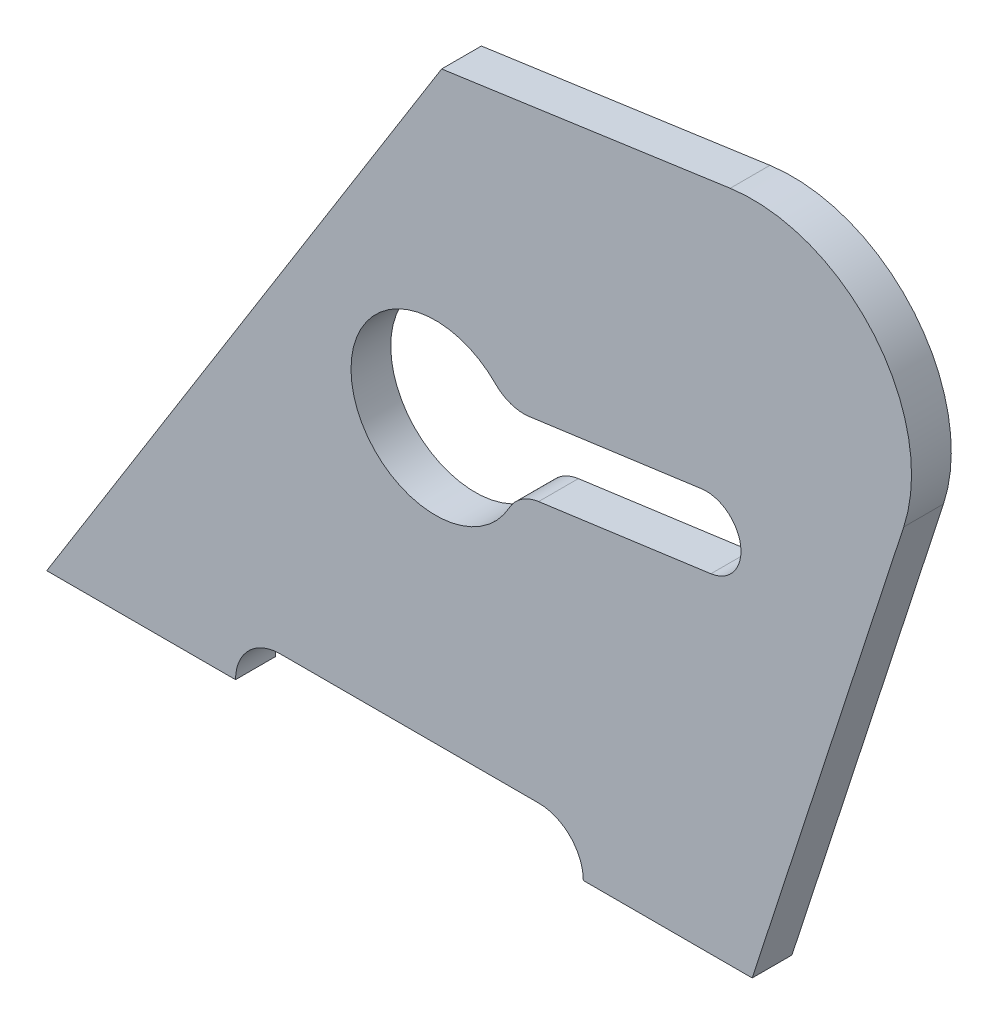
ISO-10303-21;
HEADER;
FILE_DESCRIPTION(('STEP AP214'),'2;1');
FILE_NAME('part.step','',(''),(''),'','','');
FILE_SCHEMA(('AUTOMOTIVE_DESIGN { 1 0 10303 214 1 1 1 1 }'));
ENDSEC;
DATA;
#1=APPLICATION_CONTEXT('core data for automotive mechanical design processes');
#2=APPLICATION_PROTOCOL_DEFINITION('international standard','automotive_design',2000,#1);
#3=PRODUCT_CONTEXT('',#1,'mechanical');
#4=PRODUCT('Part','Part','',(#3));
#5=PRODUCT_RELATED_PRODUCT_CATEGORY('part','',(#4));
#6=PRODUCT_DEFINITION_FORMATION('','',#4);
#7=PRODUCT_DEFINITION_CONTEXT('part definition',#1,'design');
#8=PRODUCT_DEFINITION('design','',#6,#7);
#9=PRODUCT_DEFINITION_SHAPE('','',#8);
#10=(LENGTH_UNIT() NAMED_UNIT(*) SI_UNIT(.MILLI.,.METRE.));
#11=(NAMED_UNIT(*) PLANE_ANGLE_UNIT() SI_UNIT($,.RADIAN.));
#12=(NAMED_UNIT(*) SI_UNIT($,.STERADIAN.) SOLID_ANGLE_UNIT());
#13=UNCERTAINTY_MEASURE_WITH_UNIT(LENGTH_MEASURE(1.E-05),#10,'distance_accuracy_value','');
#14=(GEOMETRIC_REPRESENTATION_CONTEXT(3) GLOBAL_UNCERTAINTY_ASSIGNED_CONTEXT((#13)) GLOBAL_UNIT_ASSIGNED_CONTEXT((#10,
#11,#12)) REPRESENTATION_CONTEXT('',''));
#15=CARTESIAN_POINT('',(0.,0.,0.));
#16=DIRECTION('',(0.,0.,1.));
#17=DIRECTION('',(1.,0.,0.));
#18=AXIS2_PLACEMENT_3D('',#15,#16,#17);
#19=CARTESIAN_POINT('',(142.06973961903,103.768811757372,8.));
#20=DIRECTION('',(0.,0.,-1.));
#21=DIRECTION('',(-1.,0.,0.));
#22=AXIS2_PLACEMENT_3D('',#19,#20,#21);
#23=PLANE('',#22);
#24=DIRECTION('',(1.,0.,0.));
#25=VECTOR('',#24,1.);
#26=CARTESIAN_POINT('',(38.,0.,8.));
#27=LINE('',#26,#25);
#28=CARTESIAN_POINT('',(0.,0.,8.));
#29=VERTEX_POINT('',#28);
#30=CARTESIAN_POINT('',(38.,0.,8.));
#31=VERTEX_POINT('',#30);
#32=EDGE_CURVE('E197',#29,#31,#27,.T.);
#33=ORIENTED_EDGE('',*,*,#32,.T.);
#34=CARTESIAN_POINT('',(47.,0.,8.));
#35=DIRECTION('',(0.,0.,-1.));
#36=DIRECTION('',(1.,0.,0.));
#37=AXIS2_PLACEMENT_3D('',#34,#35,#36);
#38=CIRCLE('',#37,9.);
#39=CARTESIAN_POINT('',(47.,9.,8.));
#40=VERTEX_POINT('',#39);
#41=EDGE_CURVE('E200',#31,#40,#38,.T.);
#42=ORIENTED_EDGE('',*,*,#41,.T.);
#43=DIRECTION('',(1.,0.,0.));
#44=VECTOR('',#43,1.);
#45=CARTESIAN_POINT('',(99.,9.00000000000001,8.));
#46=LINE('',#45,#44);
#47=CARTESIAN_POINT('',(99.,9.,8.));
#48=VERTEX_POINT('',#47);
#49=EDGE_CURVE('E201',#40,#48,#46,.T.);
#50=ORIENTED_EDGE('',*,*,#49,.T.);
#51=CARTESIAN_POINT('',(99.,0.,8.));
#52=DIRECTION('',(0.,0.,-1.));
#53=DIRECTION('',(1.,0.,0.));
#54=AXIS2_PLACEMENT_3D('',#51,#52,#53);
#55=CIRCLE('',#54,8.99999999999999);
#56=CARTESIAN_POINT('',(108.,0.,8.));
#57=VERTEX_POINT('',#56);
#58=EDGE_CURVE('E203',#48,#57,#55,.T.);
#59=ORIENTED_EDGE('',*,*,#58,.T.);
#60=DIRECTION('',(1.,0.,0.));
#61=VECTOR('',#60,1.);
#62=CARTESIAN_POINT('',(142.,0.,8.));
#63=LINE('',#62,#61);
#64=CARTESIAN_POINT('',(142.,0.,8.));
#65=VERTEX_POINT('',#64);
#66=EDGE_CURVE('E207',#57,#65,#63,.T.);
#67=ORIENTED_EDGE('',*,*,#66,.T.);
#68=DIRECTION('',(0.309016994374945,0.951056516295155,0.));
#69=VECTOR('',#68,1.);
#70=CARTESIAN_POINT('',(172.503548140475,93.8802679373735,8.));
#71=LINE('',#70,#69);
#72=CARTESIAN_POINT('',(172.503548140475,93.8802679373735,8.));
#73=VERTEX_POINT('',#72);
#74=EDGE_CURVE('E208',#65,#73,#71,.T.);
#75=ORIENTED_EDGE('',*,*,#74,.T.);
#76=CARTESIAN_POINT('',(142.06973961903,103.768811757372,8.));
#77=DIRECTION('',(0.,0.,1.));
#78=DIRECTION('',(-1.,0.,0.));
#79=AXIS2_PLACEMENT_3D('',#76,#77,#78);
#80=CIRCLE('',#79,32.);
#81=CARTESIAN_POINT('',(137.573015723534,135.451290735628,8.));
#82=VERTEX_POINT('',#81);
#83=EDGE_CURVE('E213',#73,#82,#80,.T.);
#84=ORIENTED_EDGE('',*,*,#83,.T.);
#85=DIRECTION('',(-0.990077468070519,-0.140522621734258,0.));
#86=VECTOR('',#85,1.);
#87=CARTESIAN_POINT('',(79.4878896349813,127.207214423464,8.));
#88=LINE('',#87,#86);
#89=CARTESIAN_POINT('',(79.4878896349813,127.207214423464,8.));
#90=VERTEX_POINT('',#89);
#91=EDGE_CURVE('E211',#82,#90,#88,.T.);
#92=ORIENTED_EDGE('',*,*,#91,.T.);
#93=DIRECTION('',(-0.529919264233209,-0.848048096156424,0.));
#94=VECTOR('',#93,1.);
#95=CARTESIAN_POINT('',(0.,0.,8.));
#96=LINE('',#95,#94);
#97=EDGE_CURVE('E214',#90,#29,#96,.T.);
#98=ORIENTED_EDGE('',*,*,#97,.T.);
#99=EDGE_LOOP('',(#33,#42,#50,#59,#67,#75,#84,#92,#98));
#100=FACE_BOUND('',#99,.T.);
#101=CARTESIAN_POINT('',(132.7354236822,73.244757424037,8.));
#102=DIRECTION('',(0.,0.,1.));
#103=DIRECTION('',(1.,0.,0.));
#104=AXIS2_PLACEMENT_3D('',#101,#102,#103);
#105=CIRCLE('',#104,7.00000000000001);
#106=CARTESIAN_POINT('',(133.685771579893,66.3095689714172,8.));
#107=VERTEX_POINT('',#106);
#108=CARTESIAN_POINT('',(131.785075784508,80.1799458766568,8.));
#109=VERTEX_POINT('',#108);
#110=EDGE_CURVE('E147',#107,#109,#105,.T.);
#111=ORIENTED_EDGE('',*,*,#110,.F.);
#112=DIRECTION('',(0.990741207517111,0.135763985384697,0.));
#113=VECTOR('',#112,1.);
#114=CARTESIAN_POINT('',(99.0098293167945,61.5578294829528,8.));
#115=LINE('',#114,#113);
#116=CARTESIAN_POINT('',(99.0098293167945,61.5578294829529,8.));
#117=VERTEX_POINT('',#116);
#118=EDGE_CURVE('E172',#117,#107,#115,.T.);
#119=ORIENTED_EDGE('',*,*,#118,.F.);
#120=CARTESIAN_POINT('',(100.095941199872,53.6318998228159,8.));
#121=DIRECTION('',(0.,0.,-1.));
#122=DIRECTION('',(1.,0.,0.));
#123=AXIS2_PLACEMENT_3D('',#120,#121,#122);
#124=CIRCLE('',#123,8.00000000000001);
#125=CARTESIAN_POINT('',(93.103530341916,57.518568112436,8.));
#126=VERTEX_POINT('',#125);
#127=EDGE_CURVE('E171',#126,#117,#124,.T.);
#128=ORIENTED_EDGE('',*,*,#127,.F.);
#129=CARTESIAN_POINT('',(78.2446572687594,65.7777382278786,8.));
#130=DIRECTION('',(0.,0.,1.));
#131=DIRECTION('',(1.,0.,0.));
#132=AXIS2_PLACEMENT_3D('',#129,#130,#131);
#133=CIRCLE('',#132,17.);
#134=CARTESIAN_POINT('',(90.3339450400682,77.7296887457851,8.));
#135=VERTEX_POINT('',#134);
#136=EDGE_CURVE('E170',#135,#126,#133,.T.);
#137=ORIENTED_EDGE('',*,*,#136,.F.);
#138=CARTESIAN_POINT('',(96.0230216383311,83.3541360483293,8.));
#139=DIRECTION('',(0.,0.,-1.));
#140=DIRECTION('',(-1.,0.,0.));
#141=AXIS2_PLACEMENT_3D('',#138,#139,#140);
#142=CIRCLE('',#141,7.99999999999999);
#143=CARTESIAN_POINT('',(97.1091335214087,75.4282063881924,8.));
#144=VERTEX_POINT('',#143);
#145=EDGE_CURVE('E167',#144,#135,#142,.T.);
#146=ORIENTED_EDGE('',*,*,#145,.F.);
#147=DIRECTION('',(-0.990741207517111,-0.135763985384699,0.));
#148=VECTOR('',#147,1.);
#149=CARTESIAN_POINT('',(97.1091335214087,75.4282063881924,8.));
#150=LINE('',#149,#148);
#151=EDGE_CURVE('E153',#109,#144,#150,.T.);
#152=ORIENTED_EDGE('',*,*,#151,.F.);
#153=EDGE_LOOP('',(#111,#119,#128,#137,#146,#152));
#154=FACE_BOUND('',#153,.T.);
#155=ADVANCED_FACE('F39',(#100,#154),#23,.F.);
#156=CARTESIAN_POINT('',(142.06973961903,103.768811757372,0.));
#157=DIRECTION('',(0.,0.,-1.));
#158=DIRECTION('',(-1.,0.,0.));
#159=AXIS2_PLACEMENT_3D('',#156,#157,#158);
#160=PLANE('',#159);
#161=DIRECTION('',(1.,0.,0.));
#162=VECTOR('',#161,1.);
#163=CARTESIAN_POINT('',(38.,0.,0.));
#164=LINE('',#163,#162);
#165=CARTESIAN_POINT('',(0.,0.,0.));
#166=VERTEX_POINT('',#165);
#167=CARTESIAN_POINT('',(38.,0.,0.));
#168=VERTEX_POINT('',#167);
#169=EDGE_CURVE('E162',#166,#168,#164,.T.);
#170=ORIENTED_EDGE('',*,*,#169,.F.);
#171=DIRECTION('',(-0.529919264233209,-0.848048096156424,0.));
#172=VECTOR('',#171,1.);
#173=CARTESIAN_POINT('',(0.,0.,0.));
#174=LINE('',#173,#172);
#175=CARTESIAN_POINT('',(79.4878896349813,127.207214423464,0.));
#176=VERTEX_POINT('',#175);
#177=EDGE_CURVE('E202',#176,#166,#174,.T.);
#178=ORIENTED_EDGE('',*,*,#177,.F.);
#179=DIRECTION('',(-0.990077468070519,-0.140522621734258,0.));
#180=VECTOR('',#179,1.);
#181=CARTESIAN_POINT('',(79.4878896349813,127.207214423464,0.));
#182=LINE('',#181,#180);
#183=CARTESIAN_POINT('',(137.573015723534,135.451290735628,0.));
#184=VERTEX_POINT('',#183);
#185=EDGE_CURVE('E235',#184,#176,#182,.T.);
#186=ORIENTED_EDGE('',*,*,#185,.F.);
#187=CARTESIAN_POINT('',(142.06973961903,103.768811757372,0.));
#188=DIRECTION('',(0.,0.,1.));
#189=DIRECTION('',(-1.,0.,0.));
#190=AXIS2_PLACEMENT_3D('',#187,#188,#189);
#191=CIRCLE('',#190,32.);
#192=CARTESIAN_POINT('',(172.503548140475,93.8802679373735,0.));
#193=VERTEX_POINT('',#192);
#194=EDGE_CURVE('E229',#193,#184,#191,.T.);
#195=ORIENTED_EDGE('',*,*,#194,.F.);
#196=DIRECTION('',(0.309016994374945,0.951056516295155,0.));
#197=VECTOR('',#196,1.);
#198=CARTESIAN_POINT('',(172.503548140475,93.8802679373735,0.));
#199=LINE('',#198,#197);
#200=CARTESIAN_POINT('',(142.,0.,0.));
#201=VERTEX_POINT('',#200);
#202=EDGE_CURVE('E228',#201,#193,#199,.T.);
#203=ORIENTED_EDGE('',*,*,#202,.F.);
#204=DIRECTION('',(1.,0.,0.));
#205=VECTOR('',#204,1.);
#206=CARTESIAN_POINT('',(142.,0.,0.));
#207=LINE('',#206,#205);
#208=CARTESIAN_POINT('',(108.,0.,0.));
#209=VERTEX_POINT('',#208);
#210=EDGE_CURVE('E226',#209,#201,#207,.T.);
#211=ORIENTED_EDGE('',*,*,#210,.F.);
#212=CARTESIAN_POINT('',(99.,0.,0.));
#213=DIRECTION('',(0.,0.,-1.));
#214=DIRECTION('',(1.,0.,0.));
#215=AXIS2_PLACEMENT_3D('',#212,#213,#214);
#216=CIRCLE('',#215,8.99999999999999);
#217=CARTESIAN_POINT('',(99.,9.,0.));
#218=VERTEX_POINT('',#217);
#219=EDGE_CURVE('E222',#218,#209,#216,.T.);
#220=ORIENTED_EDGE('',*,*,#219,.F.);
#221=DIRECTION('',(1.,0.,0.));
#222=VECTOR('',#221,1.);
#223=CARTESIAN_POINT('',(99.,9.00000000000001,0.));
#224=LINE('',#223,#222);
#225=CARTESIAN_POINT('',(47.,9.,0.));
#226=VERTEX_POINT('',#225);
#227=EDGE_CURVE('E225',#226,#218,#224,.T.);
#228=ORIENTED_EDGE('',*,*,#227,.F.);
#229=CARTESIAN_POINT('',(47.,0.,0.));
#230=DIRECTION('',(0.,0.,-1.));
#231=DIRECTION('',(1.,0.,0.));
#232=AXIS2_PLACEMENT_3D('',#229,#230,#231);
#233=CIRCLE('',#232,9.);
#234=EDGE_CURVE('E217',#168,#226,#233,.T.);
#235=ORIENTED_EDGE('',*,*,#234,.F.);
#236=EDGE_LOOP('',(#170,#178,#186,#195,#203,#211,#220,#228,#235));
#237=FACE_BOUND('',#236,.T.);
#238=DIRECTION('',(0.990741207517111,0.135763985384697,0.));
#239=VECTOR('',#238,1.);
#240=CARTESIAN_POINT('',(99.0098293167945,61.5578294829528,0.));
#241=LINE('',#240,#239);
#242=CARTESIAN_POINT('',(99.0098293167945,61.5578294829528,0.));
#243=VERTEX_POINT('',#242);
#244=CARTESIAN_POINT('',(133.685771579893,66.3095689714173,0.));
#245=VERTEX_POINT('',#244);
#246=EDGE_CURVE('E155',#243,#245,#241,.T.);
#247=ORIENTED_EDGE('',*,*,#246,.T.);
#248=CARTESIAN_POINT('',(132.7354236822,73.244757424037,0.));
#249=DIRECTION('',(0.,0.,1.));
#250=DIRECTION('',(1.,0.,0.));
#251=AXIS2_PLACEMENT_3D('',#248,#249,#250);
#252=CIRCLE('',#251,7.00000000000001);
#253=CARTESIAN_POINT('',(131.785075784508,80.1799458766568,0.));
#254=VERTEX_POINT('',#253);
#255=EDGE_CURVE('E62',#245,#254,#252,.T.);
#256=ORIENTED_EDGE('',*,*,#255,.T.);
#257=DIRECTION('',(-0.990741207517111,-0.135763985384699,0.));
#258=VECTOR('',#257,1.);
#259=CARTESIAN_POINT('',(97.1091335214087,75.4282063881924,0.));
#260=LINE('',#259,#258);
#261=CARTESIAN_POINT('',(97.1091335214087,75.4282063881924,0.));
#262=VERTEX_POINT('',#261);
#263=EDGE_CURVE('E161',#254,#262,#260,.T.);
#264=ORIENTED_EDGE('',*,*,#263,.T.);
#265=CARTESIAN_POINT('',(96.0230216383311,83.3541360483293,0.));
#266=DIRECTION('',(0.,0.,-1.));
#267=DIRECTION('',(-1.,0.,0.));
#268=AXIS2_PLACEMENT_3D('',#265,#266,#267);
#269=CIRCLE('',#268,7.99999999999999);
#270=CARTESIAN_POINT('',(90.3339450400682,77.7296887457851,0.));
#271=VERTEX_POINT('',#270);
#272=EDGE_CURVE('E177',#262,#271,#269,.T.);
#273=ORIENTED_EDGE('',*,*,#272,.T.);
#274=CARTESIAN_POINT('',(78.2446572687594,65.7777382278786,0.));
#275=DIRECTION('',(0.,0.,1.));
#276=DIRECTION('',(1.,0.,0.));
#277=AXIS2_PLACEMENT_3D('',#274,#275,#276);
#278=CIRCLE('',#277,17.);
#279=CARTESIAN_POINT('',(93.103530341916,57.518568112436,0.));
#280=VERTEX_POINT('',#279);
#281=EDGE_CURVE('E185',#271,#280,#278,.T.);
#282=ORIENTED_EDGE('',*,*,#281,.T.);
#283=CARTESIAN_POINT('',(100.095941199872,53.6318998228159,0.));
#284=DIRECTION('',(0.,0.,-1.));
#285=DIRECTION('',(1.,0.,0.));
#286=AXIS2_PLACEMENT_3D('',#283,#284,#285);
#287=CIRCLE('',#286,8.00000000000001);
#288=EDGE_CURVE('E184',#280,#243,#287,.T.);
#289=ORIENTED_EDGE('',*,*,#288,.T.);
#290=EDGE_LOOP('',(#247,#256,#264,#273,#282,#289));
#291=FACE_BOUND('',#290,.T.);
#292=ADVANCED_FACE('F262',(#237,#291),#160,.T.);
#293=CARTESIAN_POINT('',(38.,0.,8.));
#294=DIRECTION('',(0.,1.,0.));
#295=DIRECTION('',(-1.,0.,0.));
#296=AXIS2_PLACEMENT_3D('',#293,#294,#295);
#297=PLANE('',#296);
#298=ORIENTED_EDGE('',*,*,#169,.T.);
#299=DIRECTION('',(0.,0.,-1.));
#300=VECTOR('',#299,1.);
#301=CARTESIAN_POINT('',(38.,0.,8.));
#302=LINE('',#301,#300);
#303=EDGE_CURVE('E11',#31,#168,#302,.T.);
#304=ORIENTED_EDGE('',*,*,#303,.F.);
#305=ORIENTED_EDGE('',*,*,#32,.F.);
#306=DIRECTION('',(0.,0.,-1.));
#307=VECTOR('',#306,1.);
#308=CARTESIAN_POINT('',(0.,0.,8.));
#309=LINE('',#308,#307);
#310=EDGE_CURVE('E220',#29,#166,#309,.T.);
#311=ORIENTED_EDGE('',*,*,#310,.T.);
#312=EDGE_LOOP('',(#298,#304,#305,#311));
#313=FACE_BOUND('',#312,.T.);
#314=ADVANCED_FACE('F41',(#313),#297,.F.);
#315=CARTESIAN_POINT('',(47.,0.,8.));
#316=DIRECTION('',(0.,0.,-1.));
#317=DIRECTION('',(-1.,0.,0.));
#318=AXIS2_PLACEMENT_3D('',#315,#316,#317);
#319=CYLINDRICAL_SURFACE('',#318,9.);
#320=ORIENTED_EDGE('',*,*,#234,.T.);
#321=DIRECTION('',(0.,0.,-1.));
#322=VECTOR('',#321,1.);
#323=CARTESIAN_POINT('',(47.,9.,8.));
#324=LINE('',#323,#322);
#325=EDGE_CURVE('E50',#40,#226,#324,.T.);
#326=ORIENTED_EDGE('',*,*,#325,.F.);
#327=ORIENTED_EDGE('',*,*,#41,.F.);
#328=ORIENTED_EDGE('',*,*,#303,.T.);
#329=EDGE_LOOP('',(#320,#326,#327,#328));
#330=FACE_BOUND('',#329,.T.);
#331=ADVANCED_FACE('F285',(#330),#319,.F.);
#332=CARTESIAN_POINT('',(99.,9.00000000000001,8.));
#333=DIRECTION('',(0.,1.,0.));
#334=DIRECTION('',(-1.,0.,0.));
#335=AXIS2_PLACEMENT_3D('',#332,#333,#334);
#336=PLANE('',#335);
#337=ORIENTED_EDGE('',*,*,#227,.T.);
#338=DIRECTION('',(0.,0.,-1.));
#339=VECTOR('',#338,1.);
#340=CARTESIAN_POINT('',(99.,9.,8.));
#341=LINE('',#340,#339);
#342=EDGE_CURVE('E252',#48,#218,#341,.T.);
#343=ORIENTED_EDGE('',*,*,#342,.F.);
#344=ORIENTED_EDGE('',*,*,#49,.F.);
#345=ORIENTED_EDGE('',*,*,#325,.T.);
#346=EDGE_LOOP('',(#337,#343,#344,#345));
#347=FACE_BOUND('',#346,.T.);
#348=ADVANCED_FACE('F260',(#347),#336,.F.);
#349=CARTESIAN_POINT('',(99.,0.,8.));
#350=DIRECTION('',(0.,0.,-1.));
#351=DIRECTION('',(-1.,0.,0.));
#352=AXIS2_PLACEMENT_3D('',#349,#350,#351);
#353=CYLINDRICAL_SURFACE('',#352,8.99999999999999);
#354=ORIENTED_EDGE('',*,*,#219,.T.);
#355=DIRECTION('',(0.,0.,-1.));
#356=VECTOR('',#355,1.);
#357=CARTESIAN_POINT('',(108.,0.,8.));
#358=LINE('',#357,#356);
#359=EDGE_CURVE('E249',#57,#209,#358,.T.);
#360=ORIENTED_EDGE('',*,*,#359,.F.);
#361=ORIENTED_EDGE('',*,*,#58,.F.);
#362=ORIENTED_EDGE('',*,*,#342,.T.);
#363=EDGE_LOOP('',(#354,#360,#361,#362));
#364=FACE_BOUND('',#363,.T.);
#365=ADVANCED_FACE('F271',(#364),#353,.F.);
#366=CARTESIAN_POINT('',(142.,0.,8.));
#367=DIRECTION('',(0.,1.,0.));
#368=DIRECTION('',(-1.,0.,0.));
#369=AXIS2_PLACEMENT_3D('',#366,#367,#368);
#370=PLANE('',#369);
#371=ORIENTED_EDGE('',*,*,#210,.T.);
#372=DIRECTION('',(0.,0.,-1.));
#373=VECTOR('',#372,1.);
#374=CARTESIAN_POINT('',(142.,0.,8.));
#375=LINE('',#374,#373);
#376=EDGE_CURVE('E247',#65,#201,#375,.T.);
#377=ORIENTED_EDGE('',*,*,#376,.F.);
#378=ORIENTED_EDGE('',*,*,#66,.F.);
#379=ORIENTED_EDGE('',*,*,#359,.T.);
#380=EDGE_LOOP('',(#371,#377,#378,#379));
#381=FACE_BOUND('',#380,.T.);
#382=ADVANCED_FACE('F274',(#381),#370,.F.);
#383=CARTESIAN_POINT('',(172.503548140475,93.8802679373735,8.));
#384=DIRECTION('',(-0.951056516295154,0.309016994374945,0.));
#385=DIRECTION('',(-0.309016994374945,-0.951056516295155,0.));
#386=AXIS2_PLACEMENT_3D('',#383,#384,#385);
#387=PLANE('',#386);
#388=ORIENTED_EDGE('',*,*,#202,.T.);
#389=DIRECTION('',(0.,0.,-1.));
#390=VECTOR('',#389,1.);
#391=CARTESIAN_POINT('',(172.503548140475,93.8802679373735,8.));
#392=LINE('',#391,#390);
#393=EDGE_CURVE('E244',#73,#193,#392,.T.);
#394=ORIENTED_EDGE('',*,*,#393,.F.);
#395=ORIENTED_EDGE('',*,*,#74,.F.);
#396=ORIENTED_EDGE('',*,*,#376,.T.);
#397=EDGE_LOOP('',(#388,#394,#395,#396));
#398=FACE_BOUND('',#397,.T.);
#399=ADVANCED_FACE('F300',(#398),#387,.F.);
#400=CARTESIAN_POINT('',(142.06973961903,103.768811757372,8.));
#401=DIRECTION('',(0.,0.,-1.));
#402=DIRECTION('',(-1.,0.,0.));
#403=AXIS2_PLACEMENT_3D('',#400,#401,#402);
#404=CYLINDRICAL_SURFACE('',#403,32.);
#405=ORIENTED_EDGE('',*,*,#194,.T.);
#406=DIRECTION('',(0.,0.,-1.));
#407=VECTOR('',#406,1.);
#408=CARTESIAN_POINT('',(137.573015723534,135.451290735628,8.));
#409=LINE('',#408,#407);
#410=EDGE_CURVE('E238',#82,#184,#409,.T.);
#411=ORIENTED_EDGE('',*,*,#410,.F.);
#412=ORIENTED_EDGE('',*,*,#83,.F.);
#413=ORIENTED_EDGE('',*,*,#393,.T.);
#414=EDGE_LOOP('',(#405,#411,#412,#413));
#415=FACE_BOUND('',#414,.T.);
#416=ADVANCED_FACE('F299',(#415),#404,.T.);
#417=CARTESIAN_POINT('',(79.4878896349813,127.207214423464,8.));
#418=DIRECTION('',(0.140522621734258,-0.99007746807052,0.));
#419=DIRECTION('',(0.990077468070519,0.140522621734258,0.));
#420=AXIS2_PLACEMENT_3D('',#417,#418,#419);
#421=PLANE('',#420);
#422=ORIENTED_EDGE('',*,*,#185,.T.);
#423=DIRECTION('',(0.,0.,-1.));
#424=VECTOR('',#423,1.);
#425=CARTESIAN_POINT('',(79.4878896349813,127.207214423464,8.));
#426=LINE('',#425,#424);
#427=EDGE_CURVE('E240',#90,#176,#426,.T.);
#428=ORIENTED_EDGE('',*,*,#427,.F.);
#429=ORIENTED_EDGE('',*,*,#91,.F.);
#430=ORIENTED_EDGE('',*,*,#410,.T.);
#431=EDGE_LOOP('',(#422,#428,#429,#430));
#432=FACE_BOUND('',#431,.T.);
#433=ADVANCED_FACE('F294',(#432),#421,.F.);
#434=CARTESIAN_POINT('',(0.,0.,8.));
#435=DIRECTION('',(0.848048096156424,-0.529919264233209,0.));
#436=DIRECTION('',(0.529919264233209,0.848048096156424,0.));
#437=AXIS2_PLACEMENT_3D('',#434,#435,#436);
#438=PLANE('',#437);
#439=ORIENTED_EDGE('',*,*,#177,.T.);
#440=ORIENTED_EDGE('',*,*,#310,.F.);
#441=ORIENTED_EDGE('',*,*,#97,.F.);
#442=ORIENTED_EDGE('',*,*,#427,.T.);
#443=EDGE_LOOP('',(#439,#440,#441,#442));
#444=FACE_BOUND('',#443,.T.);
#445=ADVANCED_FACE('F288',(#444),#438,.F.);
#446=CARTESIAN_POINT('',(132.7354236822,73.244757424037,8.));
#447=DIRECTION('',(0.,0.,-1.));
#448=DIRECTION('',(-1.,0.,0.));
#449=AXIS2_PLACEMENT_3D('',#446,#447,#448);
#450=CYLINDRICAL_SURFACE('',#449,7.00000000000001);
#451=ORIENTED_EDGE('',*,*,#255,.F.);
#452=DIRECTION('',(0.,0.,-1.));
#453=VECTOR('',#452,1.);
#454=CARTESIAN_POINT('',(133.685771579893,66.3095689714172,8.));
#455=LINE('',#454,#453);
#456=EDGE_CURVE('E148',#107,#245,#455,.T.);
#457=ORIENTED_EDGE('',*,*,#456,.F.);
#458=ORIENTED_EDGE('',*,*,#110,.T.);
#459=DIRECTION('',(0.,0.,-1.));
#460=VECTOR('',#459,1.);
#461=CARTESIAN_POINT('',(131.785075784508,80.1799458766568,8.));
#462=LINE('',#461,#460);
#463=EDGE_CURVE('E146',#109,#254,#462,.T.);
#464=ORIENTED_EDGE('',*,*,#463,.T.);
#465=EDGE_LOOP('',(#451,#457,#458,#464));
#466=FACE_BOUND('',#465,.T.);
#467=ADVANCED_FACE('F149',(#466),#450,.F.);
#468=CARTESIAN_POINT('',(97.1091335214087,75.4282063881924,8.));
#469=DIRECTION('',(0.135763985384699,-0.990741207517111,0.));
#470=DIRECTION('',(0.990741207517111,0.135763985384699,0.));
#471=AXIS2_PLACEMENT_3D('',#468,#469,#470);
#472=PLANE('',#471);
#473=ORIENTED_EDGE('',*,*,#263,.F.);
#474=ORIENTED_EDGE('',*,*,#463,.F.);
#475=ORIENTED_EDGE('',*,*,#151,.T.);
#476=DIRECTION('',(0.,0.,-1.));
#477=VECTOR('',#476,1.);
#478=CARTESIAN_POINT('',(97.1091335214087,75.4282063881924,8.));
#479=LINE('',#478,#477);
#480=EDGE_CURVE('E164',#144,#262,#479,.T.);
#481=ORIENTED_EDGE('',*,*,#480,.T.);
#482=EDGE_LOOP('',(#473,#474,#475,#481));
#483=FACE_BOUND('',#482,.T.);
#484=ADVANCED_FACE('F156',(#483),#472,.T.);
#485=CARTESIAN_POINT('',(96.0230216383311,83.3541360483293,8.));
#486=DIRECTION('',(0.,0.,-1.));
#487=DIRECTION('',(-1.,0.,0.));
#488=AXIS2_PLACEMENT_3D('',#485,#486,#487);
#489=CYLINDRICAL_SURFACE('',#488,7.99999999999999);
#490=ORIENTED_EDGE('',*,*,#272,.F.);
#491=ORIENTED_EDGE('',*,*,#480,.F.);
#492=ORIENTED_EDGE('',*,*,#145,.T.);
#493=DIRECTION('',(0.,0.,-1.));
#494=VECTOR('',#493,1.);
#495=CARTESIAN_POINT('',(90.3339450400682,77.7296887457851,8.));
#496=LINE('',#495,#494);
#497=EDGE_CURVE('E191',#135,#271,#496,.T.);
#498=ORIENTED_EDGE('',*,*,#497,.T.);
#499=EDGE_LOOP('',(#490,#491,#492,#498));
#500=FACE_BOUND('',#499,.T.);
#501=ADVANCED_FACE('F344',(#500),#489,.T.);
#502=CARTESIAN_POINT('',(78.2446572687594,65.7777382278786,8.));
#503=DIRECTION('',(0.,0.,-1.));
#504=DIRECTION('',(-1.,0.,0.));
#505=AXIS2_PLACEMENT_3D('',#502,#503,#504);
#506=CYLINDRICAL_SURFACE('',#505,17.);
#507=ORIENTED_EDGE('',*,*,#281,.F.);
#508=ORIENTED_EDGE('',*,*,#497,.F.);
#509=ORIENTED_EDGE('',*,*,#136,.T.);
#510=DIRECTION('',(0.,0.,-1.));
#511=VECTOR('',#510,1.);
#512=CARTESIAN_POINT('',(93.103530341916,57.518568112436,8.));
#513=LINE('',#512,#511);
#514=EDGE_CURVE('E195',#126,#280,#513,.T.);
#515=ORIENTED_EDGE('',*,*,#514,.T.);
#516=EDGE_LOOP('',(#507,#508,#509,#515));
#517=FACE_BOUND('',#516,.T.);
#518=ADVANCED_FACE('F349',(#517),#506,.F.);
#519=CARTESIAN_POINT('',(100.095941199872,53.6318998228159,8.));
#520=DIRECTION('',(0.,0.,-1.));
#521=DIRECTION('',(-1.,0.,0.));
#522=AXIS2_PLACEMENT_3D('',#519,#520,#521);
#523=CYLINDRICAL_SURFACE('',#522,8.00000000000001);
#524=ORIENTED_EDGE('',*,*,#288,.F.);
#525=ORIENTED_EDGE('',*,*,#514,.F.);
#526=ORIENTED_EDGE('',*,*,#127,.T.);
#527=DIRECTION('',(0.,0.,-1.));
#528=VECTOR('',#527,1.);
#529=CARTESIAN_POINT('',(99.0098293167945,61.5578294829528,8.));
#530=LINE('',#529,#528);
#531=EDGE_CURVE('E53',#117,#243,#530,.T.);
#532=ORIENTED_EDGE('',*,*,#531,.T.);
#533=EDGE_LOOP('',(#524,#525,#526,#532));
#534=FACE_BOUND('',#533,.T.);
#535=ADVANCED_FACE('F357',(#534),#523,.T.);
#536=CARTESIAN_POINT('',(99.0098293167945,61.5578294829528,8.));
#537=DIRECTION('',(-0.135763985384698,0.990741207517111,0.));
#538=DIRECTION('',(-0.990741207517111,-0.135763985384697,0.));
#539=AXIS2_PLACEMENT_3D('',#536,#537,#538);
#540=PLANE('',#539);
#541=ORIENTED_EDGE('',*,*,#246,.F.);
#542=ORIENTED_EDGE('',*,*,#531,.F.);
#543=ORIENTED_EDGE('',*,*,#118,.T.);
#544=ORIENTED_EDGE('',*,*,#456,.T.);
#545=EDGE_LOOP('',(#541,#542,#543,#544));
#546=FACE_BOUND('',#545,.T.);
#547=ADVANCED_FACE('F367',(#546),#540,.T.);
#548=CLOSED_SHELL('',(#155,#292,#314,#331,#348,#365,#382,#399,#416,#433,#445,#467,#484,#501,
#518,#535,#547));
#549=MANIFOLD_SOLID_BREP('B2',#548);
#550=ADVANCED_BREP_SHAPE_REPRESENTATION('',(#18,#549),#14);
#551=SHAPE_DEFINITION_REPRESENTATION(#9,#550);
ENDSEC;
END-ISO-10303-21;
